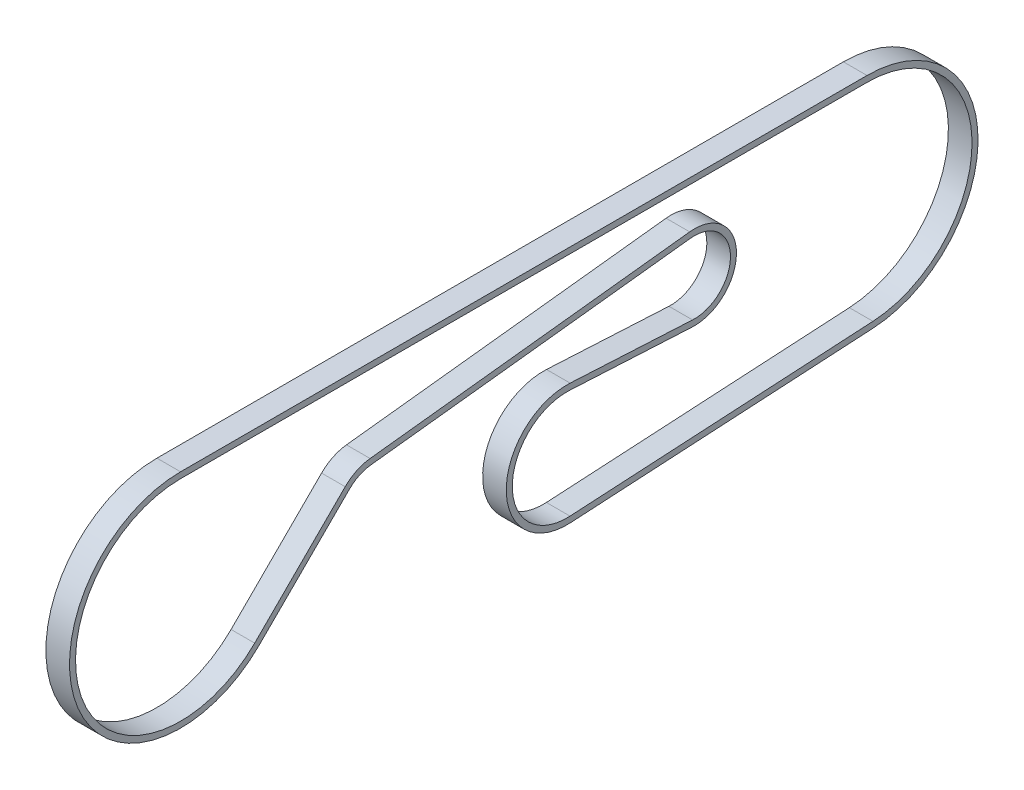
ISO-10303-21;
HEADER;
FILE_DESCRIPTION(('STEP AP214'),'2;1');
FILE_NAME('part.step','',(''),(''),'','','');
FILE_SCHEMA(('AUTOMOTIVE_DESIGN { 1 0 10303 214 1 1 1 1 }'));
ENDSEC;
DATA;
#1=APPLICATION_CONTEXT('core data for automotive mechanical design processes');
#2=APPLICATION_PROTOCOL_DEFINITION('international standard','automotive_design',2000,#1);
#3=PRODUCT_CONTEXT('',#1,'mechanical');
#4=PRODUCT('Part','Part','',(#3));
#5=PRODUCT_RELATED_PRODUCT_CATEGORY('part','',(#4));
#6=PRODUCT_DEFINITION_FORMATION('','',#4);
#7=PRODUCT_DEFINITION_CONTEXT('part definition',#1,'design');
#8=PRODUCT_DEFINITION('design','',#6,#7);
#9=PRODUCT_DEFINITION_SHAPE('','',#8);
#10=(LENGTH_UNIT() NAMED_UNIT(*) SI_UNIT(.MILLI.,.METRE.));
#11=(NAMED_UNIT(*) PLANE_ANGLE_UNIT() SI_UNIT($,.RADIAN.));
#12=(NAMED_UNIT(*) SI_UNIT($,.STERADIAN.) SOLID_ANGLE_UNIT());
#13=UNCERTAINTY_MEASURE_WITH_UNIT(LENGTH_MEASURE(1.E-05),#10,'distance_accuracy_value','');
#14=(GEOMETRIC_REPRESENTATION_CONTEXT(3) GLOBAL_UNCERTAINTY_ASSIGNED_CONTEXT((#13)) GLOBAL_UNIT_ASSIGNED_CONTEXT((#10,
#11,#12)) REPRESENTATION_CONTEXT('',''));
#15=CARTESIAN_POINT('',(0.,0.,0.));
#16=DIRECTION('',(0.,0.,1.));
#17=DIRECTION('',(1.,0.,0.));
#18=AXIS2_PLACEMENT_3D('',#15,#16,#17);
#19=CARTESIAN_POINT('',(4.,-64.0932049847498,68.7662754155776));
#20=DIRECTION('',(-1.,0.,0.));
#21=DIRECTION('',(0.,0.,1.));
#22=AXIS2_PLACEMENT_3D('',#19,#20,#21);
#23=PLANE('',#22);
#24=CARTESIAN_POINT('',(4.,-64.0932049847498,68.7662754155776));
#25=DIRECTION('',(1.,0.,0.));
#26=DIRECTION('',(0.,0.,1.));
#27=AXIS2_PLACEMENT_3D('',#24,#25,#26);
#28=CIRCLE('',#27,18.796);
#29=CARTESIAN_POINT('',(4.,-45.2972049847498,68.7662754155891));
#30=VERTEX_POINT('',#29);
#31=CARTESIAN_POINT('',(4.,-77.407402534687,55.4989561836737));
#32=VERTEX_POINT('',#31);
#33=EDGE_CURVE('E258',#30,#32,#28,.T.);
#34=ORIENTED_EDGE('',*,*,#33,.T.);
#35=DIRECTION('',(0.,0.705858652474131,-0.708352710679789));
#36=VECTOR('',#35,1.);
#37=CARTESIAN_POINT('',(4.,-62.1385864550402,40.1761897615601));
#38=LINE('',#37,#36);
#39=CARTESIAN_POINT('',(4.,-62.1385864550402,40.1761897615601));
#40=VERTEX_POINT('',#39);
#41=EDGE_CURVE('E261',#32,#40,#38,.T.);
#42=ORIENTED_EDGE('',*,*,#41,.T.);
#43=CARTESIAN_POINT('',(4.,-66.4567045793433,35.8732754160784));
#44=DIRECTION('',(-1.,0.,0.));
#45=DIRECTION('',(0.,0.,-1.));
#46=AXIS2_PLACEMENT_3D('',#43,#44,#45);
#47=CIRCLE('',#46,6.09599999999889);
#48=CARTESIAN_POINT('',(4.,-60.400008433644,36.5643960992142));
#49=VERTEX_POINT('',#48);
#50=EDGE_CURVE('E264',#40,#49,#47,.T.);
#51=ORIENTED_EDGE('',*,*,#50,.T.);
#52=DIRECTION('',(0.,0.113372815475126,-0.993552517339292));
#53=VECTOR('',#52,1.);
#54=CARTESIAN_POINT('',(4.,-54.2265088392206,-17.5376039007609));
#55=LINE('',#54,#53);
#56=CARTESIAN_POINT('',(4.,-54.2265088392206,-17.5376039007609));
#57=VERTEX_POINT('',#56);
#58=EDGE_CURVE('E266',#49,#57,#55,.T.);
#59=ORIENTED_EDGE('',*,*,#58,.T.);
#60=CARTESIAN_POINT('',(4.,-60.2832049849702,-18.2287245834654));
#61=DIRECTION('',(-1.,0.,0.));
#62=DIRECTION('',(0.,0.,-1.));
#63=AXIS2_PLACEMENT_3D('',#60,#61,#62);
#64=CIRCLE('',#63,6.09599999999998);
#65=CARTESIAN_POINT('',(4.,-66.3706503664163,-17.9058860357203));
#66=VERTEX_POINT('',#65);
#67=EDGE_CURVE('E268',#57,#66,#64,.T.);
#68=ORIENTED_EDGE('',*,*,#67,.T.);
#69=DIRECTION('',(0.,0.0529590794253495,0.998596683304336));
#70=VECTOR('',#69,1.);
#71=CARTESIAN_POINT('',(4.,-65.2716114573325,2.81759747914179));
#72=LINE('',#71,#70);
#73=CARTESIAN_POINT('',(4.,-65.2716114573325,2.81759747914179));
#74=VERTEX_POINT('',#73);
#75=EDGE_CURVE('E270',#66,#74,#72,.T.);
#76=ORIENTED_EDGE('',*,*,#75,.T.);
#77=CARTESIAN_POINT('',(4.,-75.5232050081349,3.36127538852227));
#78=DIRECTION('',(1.,0.,0.));
#79=DIRECTION('',(0.,0.,1.));
#80=AXIS2_PLACEMENT_3D('',#77,#78,#79);
#81=CIRCLE('',#80,10.2660000000001);
#82=CARTESIAN_POINT('',(4.,-85.7726755011389,2.77894334145401));
#83=VERTEX_POINT('',#82);
#84=EDGE_CURVE('E272',#74,#83,#81,.T.);
#85=ORIENTED_EDGE('',*,*,#84,.T.);
#86=DIRECTION('',(0.,0.0567243373337524,-0.998389878531452));
#87=VECTOR('',#86,1.);
#88=CARTESIAN_POINT('',(4.,-82.8589411416271,-48.5049152279271));
#89=LINE('',#88,#87);
#90=CARTESIAN_POINT('',(4.,-82.8589411416271,-48.5049152279271));
#91=VERTEX_POINT('',#90);
#92=EDGE_CURVE('E274',#83,#91,#89,.T.);
#93=ORIENTED_EDGE('',*,*,#92,.T.);
#94=CARTESIAN_POINT('',(4.,-64.0932049847498,-47.4387245834016));
#95=DIRECTION('',(1.,0.,0.));
#96=DIRECTION('',(0.,0.,-1.));
#97=AXIS2_PLACEMENT_3D('',#94,#95,#96);
#98=CIRCLE('',#97,18.7960000000001);
#99=CARTESIAN_POINT('',(4.,-45.2972049847497,-47.4387245833902));
#100=VERTEX_POINT('',#99);
#101=EDGE_CURVE('E276',#91,#100,#98,.T.);
#102=ORIENTED_EDGE('',*,*,#101,.T.);
#103=DIRECTION('',(0.,0.,1.));
#104=VECTOR('',#103,1.);
#105=CARTESIAN_POINT('',(4.,-45.2972049847498,68.7662754155891));
#106=LINE('',#105,#104);
#107=EDGE_CURVE('E278',#100,#30,#106,.T.);
#108=ORIENTED_EDGE('',*,*,#107,.T.);
#109=EDGE_LOOP('',(#34,#42,#51,#59,#68,#76,#85,#93,#102,#108));
#110=FACE_BOUND('',#109,.T.);
#111=CARTESIAN_POINT('',(4.,-64.0932049847498,-47.4387245834016));
#112=DIRECTION('',(1.,0.,0.));
#113=DIRECTION('',(0.,0.,-1.));
#114=AXIS2_PLACEMENT_3D('',#111,#112,#113);
#115=CIRCLE('',#114,17.78);
#116=CARTESIAN_POINT('',(4.,-81.8445770250391,-48.447283301196));
#117=VERTEX_POINT('',#116);
#118=CARTESIAN_POINT('',(4.,-46.3132049847499,-47.4387245834016));
#119=VERTEX_POINT('',#118);
#120=EDGE_CURVE('E179',#117,#119,#115,.T.);
#121=ORIENTED_EDGE('',*,*,#120,.F.);
#122=DIRECTION('',(0.,0.0567243373337524,-0.998389878531452));
#123=VECTOR('',#122,1.);
#124=CARTESIAN_POINT('',(4.,-81.8445770250391,-48.447283301196));
#125=LINE('',#124,#123);
#126=CARTESIAN_POINT('',(4.,-84.758311384551,2.83657526818516));
#127=VERTEX_POINT('',#126);
#128=EDGE_CURVE('E216',#127,#117,#125,.T.);
#129=ORIENTED_EDGE('',*,*,#128,.F.);
#130=CARTESIAN_POINT('',(4.,-75.5232050081349,3.36127538852227));
#131=DIRECTION('',(1.,0.,0.));
#132=DIRECTION('',(0.,0.,1.));
#133=AXIS2_PLACEMENT_3D('',#130,#131,#132);
#134=CIRCLE('',#133,9.25000000000014);
#135=CARTESIAN_POINT('',(4.,-66.2861856875697,2.87140390383788));
#136=VERTEX_POINT('',#135);
#137=EDGE_CURVE('E214',#136,#127,#134,.T.);
#138=ORIENTED_EDGE('',*,*,#137,.F.);
#139=DIRECTION('',(0.,0.0529590794253498,0.998596683304336));
#140=VECTOR('',#139,1.);
#141=CARTESIAN_POINT('',(4.,-66.2861856875697,2.87140390383789));
#142=LINE('',#141,#140);
#143=CARTESIAN_POINT('',(4.,-67.3852245966529,-17.8520796110115));
#144=VERTEX_POINT('',#143);
#145=EDGE_CURVE('E212',#144,#136,#142,.T.);
#146=ORIENTED_EDGE('',*,*,#145,.F.);
#147=CARTESIAN_POINT('',(4.,-60.2832049849576,-18.2287245838865));
#148=DIRECTION('',(-1.,0.,0.));
#149=DIRECTION('',(0.,0.,-1.));
#150=AXIS2_PLACEMENT_3D('',#147,#148,#149);
#151=CIRCLE('',#150,7.11200000003491);
#152=CARTESIAN_POINT('',(4.,-53.2170594816058,-17.4224171202234));
#153=VERTEX_POINT('',#152);
#154=EDGE_CURVE('E210',#153,#144,#151,.T.);
#155=ORIENTED_EDGE('',*,*,#154,.F.);
#156=DIRECTION('',(0.,0.113372815475124,-0.993552517339292));
#157=VECTOR('',#156,1.);
#158=CARTESIAN_POINT('',(4.,-53.2170594816058,-17.4224171202234));
#159=LINE('',#158,#157);
#160=CARTESIAN_POINT('',(4.,-59.3905590760275,36.6795828797374));
#161=VERTEX_POINT('',#160);
#162=EDGE_CURVE('E208',#161,#153,#159,.T.);
#163=ORIENTED_EDGE('',*,*,#162,.F.);
#164=CARTESIAN_POINT('',(4.,-66.4567045793434,35.8732754160784));
#165=DIRECTION('',(-1.,0.,0.));
#166=DIRECTION('',(0.,0.,-1.));
#167=AXIS2_PLACEMENT_3D('',#164,#165,#166);
#168=CIRCLE('',#167,7.11199999999888);
#169=CARTESIAN_POINT('',(4.,-61.4189001009895,40.8933421524737));
#170=VERTEX_POINT('',#169);
#171=EDGE_CURVE('E206',#170,#161,#168,.T.);
#172=ORIENTED_EDGE('',*,*,#171,.F.);
#173=DIRECTION('',(0.,0.70585865247413,-0.708352710679789));
#174=VECTOR('',#173,1.);
#175=CARTESIAN_POINT('',(4.,-61.4189001009895,40.8933421524737));
#176=LINE('',#175,#174);
#177=CARTESIAN_POINT('',(4.,-76.6877161806366,56.2161085745875));
#178=VERTEX_POINT('',#177);
#179=EDGE_CURVE('E202',#178,#170,#176,.T.);
#180=ORIENTED_EDGE('',*,*,#179,.F.);
#181=CARTESIAN_POINT('',(4.,-64.0932049847499,68.7662754155776));
#182=DIRECTION('',(1.,0.,0.));
#183=DIRECTION('',(0.,0.,1.));
#184=AXIS2_PLACEMENT_3D('',#181,#182,#183);
#185=CIRCLE('',#184,17.78);
#186=CARTESIAN_POINT('',(4.,-46.3132049847499,68.7662754155776));
#187=VERTEX_POINT('',#186);
#188=EDGE_CURVE('E200',#187,#178,#185,.T.);
#189=ORIENTED_EDGE('',*,*,#188,.F.);
#190=DIRECTION('',(0.,0.,1.));
#191=VECTOR('',#190,1.);
#192=CARTESIAN_POINT('',(4.,-46.3132049847499,68.7662754155776));
#193=LINE('',#192,#191);
#194=EDGE_CURVE('E187',#119,#187,#193,.T.);
#195=ORIENTED_EDGE('',*,*,#194,.F.);
#196=EDGE_LOOP('',(#121,#129,#138,#146,#155,#163,#172,#180,#189,#195));
#197=FACE_BOUND('',#196,.T.);
#198=ADVANCED_FACE('F42',(#110,#197),#23,.F.);
#199=CARTESIAN_POINT('',(0.,-64.0932049847498,68.7662754155776));
#200=DIRECTION('',(-1.,0.,0.));
#201=DIRECTION('',(0.,0.,1.));
#202=AXIS2_PLACEMENT_3D('',#199,#200,#201);
#203=PLANE('',#202);
#204=CARTESIAN_POINT('',(0.,-64.0932049847498,68.7662754155776));
#205=DIRECTION('',(1.,0.,0.));
#206=DIRECTION('',(0.,0.,1.));
#207=AXIS2_PLACEMENT_3D('',#204,#205,#206);
#208=CIRCLE('',#207,18.796);
#209=CARTESIAN_POINT('',(0.,-45.2972049847498,68.7662754155891));
#210=VERTEX_POINT('',#209);
#211=CARTESIAN_POINT('',(0.,-77.407402534687,55.4989561836737));
#212=VERTEX_POINT('',#211);
#213=EDGE_CURVE('E195',#210,#212,#208,.T.);
#214=ORIENTED_EDGE('',*,*,#213,.F.);
#215=DIRECTION('',(0.,0.,1.));
#216=VECTOR('',#215,1.);
#217=CARTESIAN_POINT('',(0.,-45.2972049847498,68.7662754155891));
#218=LINE('',#217,#216);
#219=CARTESIAN_POINT('',(0.,-45.2972049847497,-47.4387245833902));
#220=VERTEX_POINT('',#219);
#221=EDGE_CURVE('E262',#220,#210,#218,.T.);
#222=ORIENTED_EDGE('',*,*,#221,.F.);
#223=CARTESIAN_POINT('',(0.,-64.0932049847498,-47.4387245834016));
#224=DIRECTION('',(1.,0.,0.));
#225=DIRECTION('',(0.,0.,-1.));
#226=AXIS2_PLACEMENT_3D('',#223,#224,#225);
#227=CIRCLE('',#226,18.7960000000001);
#228=CARTESIAN_POINT('',(0.,-82.8589411416271,-48.5049152279271));
#229=VERTEX_POINT('',#228);
#230=EDGE_CURVE('E297',#229,#220,#227,.T.);
#231=ORIENTED_EDGE('',*,*,#230,.F.);
#232=DIRECTION('',(0.,0.0567243373337524,-0.998389878531452));
#233=VECTOR('',#232,1.);
#234=CARTESIAN_POINT('',(0.,-82.8589411416271,-48.5049152279271));
#235=LINE('',#234,#233);
#236=CARTESIAN_POINT('',(0.,-85.7726755011389,2.77894334145401));
#237=VERTEX_POINT('',#236);
#238=EDGE_CURVE('E295',#237,#229,#235,.T.);
#239=ORIENTED_EDGE('',*,*,#238,.F.);
#240=CARTESIAN_POINT('',(0.,-75.5232050081349,3.36127538852227));
#241=DIRECTION('',(1.,0.,0.));
#242=DIRECTION('',(0.,0.,1.));
#243=AXIS2_PLACEMENT_3D('',#240,#241,#242);
#244=CIRCLE('',#243,10.2660000000001);
#245=CARTESIAN_POINT('',(0.,-65.2716114573325,2.81759747914179));
#246=VERTEX_POINT('',#245);
#247=EDGE_CURVE('E293',#246,#237,#244,.T.);
#248=ORIENTED_EDGE('',*,*,#247,.F.);
#249=DIRECTION('',(0.,0.0529590794253495,0.998596683304336));
#250=VECTOR('',#249,1.);
#251=CARTESIAN_POINT('',(0.,-65.2716114573325,2.81759747914179));
#252=LINE('',#251,#250);
#253=CARTESIAN_POINT('',(0.,-66.3706503664163,-17.9058860357203));
#254=VERTEX_POINT('',#253);
#255=EDGE_CURVE('E291',#254,#246,#252,.T.);
#256=ORIENTED_EDGE('',*,*,#255,.F.);
#257=CARTESIAN_POINT('',(0.,-60.2832049849702,-18.2287245834654));
#258=DIRECTION('',(-1.,0.,0.));
#259=DIRECTION('',(0.,0.,-1.));
#260=AXIS2_PLACEMENT_3D('',#257,#258,#259);
#261=CIRCLE('',#260,6.09599999999998);
#262=CARTESIAN_POINT('',(0.,-54.2265088392206,-17.5376039007609));
#263=VERTEX_POINT('',#262);
#264=EDGE_CURVE('E289',#263,#254,#261,.T.);
#265=ORIENTED_EDGE('',*,*,#264,.F.);
#266=DIRECTION('',(0.,0.113372815475126,-0.993552517339292));
#267=VECTOR('',#266,1.);
#268=CARTESIAN_POINT('',(0.,-54.2265088392206,-17.5376039007609));
#269=LINE('',#268,#267);
#270=CARTESIAN_POINT('',(0.,-60.400008433644,36.5643960992142));
#271=VERTEX_POINT('',#270);
#272=EDGE_CURVE('E287',#271,#263,#269,.T.);
#273=ORIENTED_EDGE('',*,*,#272,.F.);
#274=CARTESIAN_POINT('',(0.,-66.4567045793433,35.8732754160784));
#275=DIRECTION('',(-1.,0.,0.));
#276=DIRECTION('',(0.,0.,-1.));
#277=AXIS2_PLACEMENT_3D('',#274,#275,#276);
#278=CIRCLE('',#277,6.09599999999889);
#279=CARTESIAN_POINT('',(0.,-62.1385864550402,40.1761897615601));
#280=VERTEX_POINT('',#279);
#281=EDGE_CURVE('E285',#280,#271,#278,.T.);
#282=ORIENTED_EDGE('',*,*,#281,.F.);
#283=DIRECTION('',(0.,0.705858652474131,-0.708352710679789));
#284=VECTOR('',#283,1.);
#285=CARTESIAN_POINT('',(0.,-62.1385864550402,40.1761897615601));
#286=LINE('',#285,#284);
#287=EDGE_CURVE('E283',#212,#280,#286,.T.);
#288=ORIENTED_EDGE('',*,*,#287,.F.);
#289=EDGE_LOOP('',(#214,#222,#231,#239,#248,#256,#265,#273,#282,#288));
#290=FACE_BOUND('',#289,.T.);
#291=DIRECTION('',(0.,0.0567243373337524,-0.998389878531452));
#292=VECTOR('',#291,1.);
#293=CARTESIAN_POINT('',(0.,-81.8445770250391,-48.447283301196));
#294=LINE('',#293,#292);
#295=CARTESIAN_POINT('',(0.,-84.758311384551,2.83657526818515));
#296=VERTEX_POINT('',#295);
#297=CARTESIAN_POINT('',(0.,-81.8445770250391,-48.447283301196));
#298=VERTEX_POINT('',#297);
#299=EDGE_CURVE('E188',#296,#298,#294,.T.);
#300=ORIENTED_EDGE('',*,*,#299,.T.);
#301=CARTESIAN_POINT('',(0.,-64.0932049847498,-47.4387245834016));
#302=DIRECTION('',(1.,0.,0.));
#303=DIRECTION('',(0.,0.,-1.));
#304=AXIS2_PLACEMENT_3D('',#301,#302,#303);
#305=CIRCLE('',#304,17.78);
#306=CARTESIAN_POINT('',(0.,-46.3132049847499,-47.4387245834016));
#307=VERTEX_POINT('',#306);
#308=EDGE_CURVE('E65',#298,#307,#305,.T.);
#309=ORIENTED_EDGE('',*,*,#308,.T.);
#310=DIRECTION('',(0.,0.,1.));
#311=VECTOR('',#310,1.);
#312=CARTESIAN_POINT('',(0.,-46.3132049847499,68.7662754155776));
#313=LINE('',#312,#311);
#314=CARTESIAN_POINT('',(0.,-46.3132049847499,68.7662754155776));
#315=VERTEX_POINT('',#314);
#316=EDGE_CURVE('E194',#307,#315,#313,.T.);
#317=ORIENTED_EDGE('',*,*,#316,.T.);
#318=CARTESIAN_POINT('',(0.,-64.0932049847499,68.7662754155776));
#319=DIRECTION('',(1.,0.,0.));
#320=DIRECTION('',(0.,0.,1.));
#321=AXIS2_PLACEMENT_3D('',#318,#319,#320);
#322=CIRCLE('',#321,17.78);
#323=CARTESIAN_POINT('',(0.,-76.6877161806366,56.2161085745875));
#324=VERTEX_POINT('',#323);
#325=EDGE_CURVE('E220',#315,#324,#322,.T.);
#326=ORIENTED_EDGE('',*,*,#325,.T.);
#327=DIRECTION('',(0.,0.70585865247413,-0.708352710679789));
#328=VECTOR('',#327,1.);
#329=CARTESIAN_POINT('',(0.,-61.4189001009895,40.8933421524737));
#330=LINE('',#329,#328);
#331=CARTESIAN_POINT('',(0.,-61.4189001009895,40.8933421524737));
#332=VERTEX_POINT('',#331);
#333=EDGE_CURVE('E223',#324,#332,#330,.T.);
#334=ORIENTED_EDGE('',*,*,#333,.T.);
#335=CARTESIAN_POINT('',(0.,-66.4567045793434,35.8732754160784));
#336=DIRECTION('',(-1.,0.,0.));
#337=DIRECTION('',(0.,0.,-1.));
#338=AXIS2_PLACEMENT_3D('',#335,#336,#337);
#339=CIRCLE('',#338,7.11199999999888);
#340=CARTESIAN_POINT('',(0.,-59.3905590760275,36.6795828797374));
#341=VERTEX_POINT('',#340);
#342=EDGE_CURVE('E226',#332,#341,#339,.T.);
#343=ORIENTED_EDGE('',*,*,#342,.T.);
#344=DIRECTION('',(0.,0.113372815475124,-0.993552517339292));
#345=VECTOR('',#344,1.);
#346=CARTESIAN_POINT('',(0.,-53.2170594816058,-17.4224171202234));
#347=LINE('',#346,#345);
#348=CARTESIAN_POINT('',(0.,-53.2170594816058,-17.4224171202234));
#349=VERTEX_POINT('',#348);
#350=EDGE_CURVE('E229',#341,#349,#347,.T.);
#351=ORIENTED_EDGE('',*,*,#350,.T.);
#352=CARTESIAN_POINT('',(0.,-60.2832049849576,-18.2287245838865));
#353=DIRECTION('',(-1.,0.,0.));
#354=DIRECTION('',(0.,0.,-1.));
#355=AXIS2_PLACEMENT_3D('',#352,#353,#354);
#356=CIRCLE('',#355,7.11200000003491);
#357=CARTESIAN_POINT('',(0.,-67.3852245966529,-17.8520796110115));
#358=VERTEX_POINT('',#357);
#359=EDGE_CURVE('E232',#349,#358,#356,.T.);
#360=ORIENTED_EDGE('',*,*,#359,.T.);
#361=DIRECTION('',(0.,0.0529590794253498,0.998596683304336));
#362=VECTOR('',#361,1.);
#363=CARTESIAN_POINT('',(0.,-66.2861856875697,2.87140390383789));
#364=LINE('',#363,#362);
#365=CARTESIAN_POINT('',(0.,-66.2861856875697,2.87140390383788));
#366=VERTEX_POINT('',#365);
#367=EDGE_CURVE('E235',#358,#366,#364,.T.);
#368=ORIENTED_EDGE('',*,*,#367,.T.);
#369=CARTESIAN_POINT('',(0.,-75.5232050081349,3.36127538852227));
#370=DIRECTION('',(1.,0.,0.));
#371=DIRECTION('',(0.,0.,1.));
#372=AXIS2_PLACEMENT_3D('',#369,#370,#371);
#373=CIRCLE('',#372,9.25000000000014);
#374=EDGE_CURVE('E238',#366,#296,#373,.T.);
#375=ORIENTED_EDGE('',*,*,#374,.T.);
#376=EDGE_LOOP('',(#300,#309,#317,#326,#334,#343,#351,#360,#368,#375));
#377=FACE_BOUND('',#376,.T.);
#378=ADVANCED_FACE('F333',(#290,#377),#203,.T.);
#379=CARTESIAN_POINT('',(4.,-64.0932049847498,68.7662754155776));
#380=DIRECTION('',(-1.,0.,0.));
#381=DIRECTION('',(0.,0.,1.));
#382=AXIS2_PLACEMENT_3D('',#379,#380,#381);
#383=CYLINDRICAL_SURFACE('',#382,18.796);
#384=ORIENTED_EDGE('',*,*,#213,.T.);
#385=DIRECTION('',(-1.,0.,0.));
#386=VECTOR('',#385,1.);
#387=CARTESIAN_POINT('',(4.,-77.407402534687,55.4989561836737));
#388=LINE('',#387,#386);
#389=EDGE_CURVE('E11',#32,#212,#388,.T.);
#390=ORIENTED_EDGE('',*,*,#389,.F.);
#391=ORIENTED_EDGE('',*,*,#33,.F.);
#392=DIRECTION('',(-1.,0.,0.));
#393=VECTOR('',#392,1.);
#394=CARTESIAN_POINT('',(4.,-45.2972049847498,68.7662754155891));
#395=LINE('',#394,#393);
#396=EDGE_CURVE('E280',#30,#210,#395,.T.);
#397=ORIENTED_EDGE('',*,*,#396,.T.);
#398=EDGE_LOOP('',(#384,#390,#391,#397));
#399=FACE_BOUND('',#398,.T.);
#400=ADVANCED_FACE('F44',(#399),#383,.T.);
#401=CARTESIAN_POINT('',(4.,-62.1385864550402,40.1761897615601));
#402=DIRECTION('',(0.,0.708352710679789,0.705858652474131));
#403=DIRECTION('',(0.,-0.705858652474131,0.708352710679789));
#404=AXIS2_PLACEMENT_3D('',#401,#402,#403);
#405=PLANE('',#404);
#406=ORIENTED_EDGE('',*,*,#287,.T.);
#407=DIRECTION('',(-1.,0.,0.));
#408=VECTOR('',#407,1.);
#409=CARTESIAN_POINT('',(4.,-62.1385864550402,40.1761897615601));
#410=LINE('',#409,#408);
#411=EDGE_CURVE('E50',#40,#280,#410,.T.);
#412=ORIENTED_EDGE('',*,*,#411,.F.);
#413=ORIENTED_EDGE('',*,*,#41,.F.);
#414=ORIENTED_EDGE('',*,*,#389,.T.);
#415=EDGE_LOOP('',(#406,#412,#413,#414));
#416=FACE_BOUND('',#415,.T.);
#417=ADVANCED_FACE('F350',(#416),#405,.F.);
#418=CARTESIAN_POINT('',(4.,-66.4567045793433,35.8732754160784));
#419=DIRECTION('',(-1.,0.,0.));
#420=DIRECTION('',(0.,0.,1.));
#421=AXIS2_PLACEMENT_3D('',#418,#419,#420);
#422=CYLINDRICAL_SURFACE('',#421,6.09599999999889);
#423=ORIENTED_EDGE('',*,*,#281,.T.);
#424=DIRECTION('',(-1.,0.,0.));
#425=VECTOR('',#424,1.);
#426=CARTESIAN_POINT('',(4.,-60.400008433644,36.5643960992142));
#427=LINE('',#426,#425);
#428=EDGE_CURVE('E320',#49,#271,#427,.T.);
#429=ORIENTED_EDGE('',*,*,#428,.F.);
#430=ORIENTED_EDGE('',*,*,#50,.F.);
#431=ORIENTED_EDGE('',*,*,#411,.T.);
#432=EDGE_LOOP('',(#423,#429,#430,#431));
#433=FACE_BOUND('',#432,.T.);
#434=ADVANCED_FACE('F327',(#433),#422,.F.);
#435=CARTESIAN_POINT('',(4.,-54.2265088392206,-17.5376039007609));
#436=DIRECTION('',(0.,0.993552517339292,0.113372815475126));
#437=DIRECTION('',(0.,-0.113372815475126,0.993552517339292));
#438=AXIS2_PLACEMENT_3D('',#435,#436,#437);
#439=PLANE('',#438);
#440=ORIENTED_EDGE('',*,*,#272,.T.);
#441=DIRECTION('',(-1.,0.,0.));
#442=VECTOR('',#441,1.);
#443=CARTESIAN_POINT('',(4.,-54.2265088392206,-17.5376039007609));
#444=LINE('',#443,#442);
#445=EDGE_CURVE('E317',#57,#263,#444,.T.);
#446=ORIENTED_EDGE('',*,*,#445,.F.);
#447=ORIENTED_EDGE('',*,*,#58,.F.);
#448=ORIENTED_EDGE('',*,*,#428,.T.);
#449=EDGE_LOOP('',(#440,#446,#447,#448));
#450=FACE_BOUND('',#449,.T.);
#451=ADVANCED_FACE('F339',(#450),#439,.F.);
#452=CARTESIAN_POINT('',(4.,-60.2832049849702,-18.2287245834654));
#453=DIRECTION('',(-1.,0.,0.));
#454=DIRECTION('',(0.,0.,1.));
#455=AXIS2_PLACEMENT_3D('',#452,#453,#454);
#456=CYLINDRICAL_SURFACE('',#455,6.09599999999998);
#457=ORIENTED_EDGE('',*,*,#264,.T.);
#458=DIRECTION('',(-1.,0.,0.));
#459=VECTOR('',#458,1.);
#460=CARTESIAN_POINT('',(4.,-66.3706503664163,-17.9058860357203));
#461=LINE('',#460,#459);
#462=EDGE_CURVE('E314',#66,#254,#461,.T.);
#463=ORIENTED_EDGE('',*,*,#462,.F.);
#464=ORIENTED_EDGE('',*,*,#67,.F.);
#465=ORIENTED_EDGE('',*,*,#445,.T.);
#466=EDGE_LOOP('',(#457,#463,#464,#465));
#467=FACE_BOUND('',#466,.T.);
#468=ADVANCED_FACE('F343',(#467),#456,.F.);
#469=CARTESIAN_POINT('',(4.,-65.2716114573325,2.81759747914179));
#470=DIRECTION('',(0.,-0.998596683304336,0.0529590794253495));
#471=DIRECTION('',(0.,-0.0529590794253495,-0.998596683304336));
#472=AXIS2_PLACEMENT_3D('',#469,#470,#471);
#473=PLANE('',#472);
#474=ORIENTED_EDGE('',*,*,#255,.T.);
#475=DIRECTION('',(-1.,0.,0.));
#476=VECTOR('',#475,1.);
#477=CARTESIAN_POINT('',(4.,-65.2716114573325,2.81759747914179));
#478=LINE('',#477,#476);
#479=EDGE_CURVE('E311',#74,#246,#478,.T.);
#480=ORIENTED_EDGE('',*,*,#479,.F.);
#481=ORIENTED_EDGE('',*,*,#75,.F.);
#482=ORIENTED_EDGE('',*,*,#462,.T.);
#483=EDGE_LOOP('',(#474,#480,#481,#482));
#484=FACE_BOUND('',#483,.T.);
#485=ADVANCED_FACE('F373',(#484),#473,.F.);
#486=CARTESIAN_POINT('',(4.,-75.5232050081349,3.36127538852227));
#487=DIRECTION('',(-1.,0.,0.));
#488=DIRECTION('',(0.,0.,1.));
#489=AXIS2_PLACEMENT_3D('',#486,#487,#488);
#490=CYLINDRICAL_SURFACE('',#489,10.2660000000001);
#491=ORIENTED_EDGE('',*,*,#247,.T.);
#492=DIRECTION('',(-1.,0.,0.));
#493=VECTOR('',#492,1.);
#494=CARTESIAN_POINT('',(4.,-85.7726755011389,2.77894334145401));
#495=LINE('',#494,#493);
#496=EDGE_CURVE('E308',#83,#237,#495,.T.);
#497=ORIENTED_EDGE('',*,*,#496,.F.);
#498=ORIENTED_EDGE('',*,*,#84,.F.);
#499=ORIENTED_EDGE('',*,*,#479,.T.);
#500=EDGE_LOOP('',(#491,#497,#498,#499));
#501=FACE_BOUND('',#500,.T.);
#502=ADVANCED_FACE('F370',(#501),#490,.T.);
#503=CARTESIAN_POINT('',(4.,-82.8589411416271,-48.5049152279271));
#504=DIRECTION('',(0.,0.998389878531451,0.0567243373337524));
#505=DIRECTION('',(0.,-0.0567243373337524,0.998389878531452));
#506=AXIS2_PLACEMENT_3D('',#503,#504,#505);
#507=PLANE('',#506);
#508=ORIENTED_EDGE('',*,*,#238,.T.);
#509=DIRECTION('',(-1.,0.,0.));
#510=VECTOR('',#509,1.);
#511=CARTESIAN_POINT('',(4.,-82.8589411416271,-48.5049152279271));
#512=LINE('',#511,#510);
#513=EDGE_CURVE('E305',#91,#229,#512,.T.);
#514=ORIENTED_EDGE('',*,*,#513,.F.);
#515=ORIENTED_EDGE('',*,*,#92,.F.);
#516=ORIENTED_EDGE('',*,*,#496,.T.);
#517=EDGE_LOOP('',(#508,#514,#515,#516));
#518=FACE_BOUND('',#517,.T.);
#519=ADVANCED_FACE('F366',(#518),#507,.F.);
#520=CARTESIAN_POINT('',(4.,-64.0932049847498,-47.4387245834016));
#521=DIRECTION('',(-1.,0.,0.));
#522=DIRECTION('',(0.,0.,1.));
#523=AXIS2_PLACEMENT_3D('',#520,#521,#522);
#524=CYLINDRICAL_SURFACE('',#523,18.7960000000001);
#525=ORIENTED_EDGE('',*,*,#230,.T.);
#526=DIRECTION('',(-1.,0.,0.));
#527=VECTOR('',#526,1.);
#528=CARTESIAN_POINT('',(4.,-45.2972049847497,-47.4387245833902));
#529=LINE('',#528,#527);
#530=EDGE_CURVE('E302',#100,#220,#529,.T.);
#531=ORIENTED_EDGE('',*,*,#530,.F.);
#532=ORIENTED_EDGE('',*,*,#101,.F.);
#533=ORIENTED_EDGE('',*,*,#513,.T.);
#534=EDGE_LOOP('',(#525,#531,#532,#533));
#535=FACE_BOUND('',#534,.T.);
#536=ADVANCED_FACE('F362',(#535),#524,.T.);
#537=CARTESIAN_POINT('',(4.,-45.2972049847498,68.7662754155891));
#538=DIRECTION('',(0.,-1.,0.));
#539=DIRECTION('',(0.,0.,-1.));
#540=AXIS2_PLACEMENT_3D('',#537,#538,#539);
#541=PLANE('',#540);
#542=ORIENTED_EDGE('',*,*,#221,.T.);
#543=ORIENTED_EDGE('',*,*,#396,.F.);
#544=ORIENTED_EDGE('',*,*,#107,.F.);
#545=ORIENTED_EDGE('',*,*,#530,.T.);
#546=EDGE_LOOP('',(#542,#543,#544,#545));
#547=FACE_BOUND('',#546,.T.);
#548=ADVANCED_FACE('F357',(#547),#541,.F.);
#549=CARTESIAN_POINT('',(4.,-64.0932049847498,-47.4387245834016));
#550=DIRECTION('',(-1.,0.,0.));
#551=DIRECTION('',(0.,0.,1.));
#552=AXIS2_PLACEMENT_3D('',#549,#550,#551);
#553=CYLINDRICAL_SURFACE('',#552,17.78);
#554=ORIENTED_EDGE('',*,*,#308,.F.);
#555=DIRECTION('',(-1.,0.,0.));
#556=VECTOR('',#555,1.);
#557=CARTESIAN_POINT('',(4.,-81.8445770250391,-48.447283301196));
#558=LINE('',#557,#556);
#559=EDGE_CURVE('E183',#117,#298,#558,.T.);
#560=ORIENTED_EDGE('',*,*,#559,.F.);
#561=ORIENTED_EDGE('',*,*,#120,.T.);
#562=DIRECTION('',(-1.,0.,0.));
#563=VECTOR('',#562,1.);
#564=CARTESIAN_POINT('',(4.,-46.3132049847499,-47.4387245834016));
#565=LINE('',#564,#563);
#566=EDGE_CURVE('E182',#119,#307,#565,.T.);
#567=ORIENTED_EDGE('',*,*,#566,.T.);
#568=EDGE_LOOP('',(#554,#560,#561,#567));
#569=FACE_BOUND('',#568,.T.);
#570=ADVANCED_FACE('F181',(#569),#553,.F.);
#571=CARTESIAN_POINT('',(4.,-46.3132049847499,68.7662754155776));
#572=DIRECTION('',(0.,-1.,0.));
#573=DIRECTION('',(0.,0.,-1.));
#574=AXIS2_PLACEMENT_3D('',#571,#572,#573);
#575=PLANE('',#574);
#576=ORIENTED_EDGE('',*,*,#316,.F.);
#577=ORIENTED_EDGE('',*,*,#566,.F.);
#578=ORIENTED_EDGE('',*,*,#194,.T.);
#579=DIRECTION('',(-1.,0.,0.));
#580=VECTOR('',#579,1.);
#581=CARTESIAN_POINT('',(4.,-46.3132049847499,68.7662754155776));
#582=LINE('',#581,#580);
#583=EDGE_CURVE('E196',#187,#315,#582,.T.);
#584=ORIENTED_EDGE('',*,*,#583,.T.);
#585=EDGE_LOOP('',(#576,#577,#578,#584));
#586=FACE_BOUND('',#585,.T.);
#587=ADVANCED_FACE('F191',(#586),#575,.T.);
#588=CARTESIAN_POINT('',(4.,-64.0932049847499,68.7662754155776));
#589=DIRECTION('',(-1.,0.,0.));
#590=DIRECTION('',(0.,0.,1.));
#591=AXIS2_PLACEMENT_3D('',#588,#589,#590);
#592=CYLINDRICAL_SURFACE('',#591,17.78);
#593=ORIENTED_EDGE('',*,*,#325,.F.);
#594=ORIENTED_EDGE('',*,*,#583,.F.);
#595=ORIENTED_EDGE('',*,*,#188,.T.);
#596=DIRECTION('',(-1.,0.,0.));
#597=VECTOR('',#596,1.);
#598=CARTESIAN_POINT('',(4.,-76.6877161806366,56.2161085745875));
#599=LINE('',#598,#597);
#600=EDGE_CURVE('E255',#178,#324,#599,.T.);
#601=ORIENTED_EDGE('',*,*,#600,.T.);
#602=EDGE_LOOP('',(#593,#594,#595,#601));
#603=FACE_BOUND('',#602,.T.);
#604=ADVANCED_FACE('F423',(#603),#592,.F.);
#605=CARTESIAN_POINT('',(4.,-61.4189001009895,40.8933421524737));
#606=DIRECTION('',(0.,0.708352710679789,0.70585865247413));
#607=DIRECTION('',(0.,-0.70585865247413,0.708352710679789));
#608=AXIS2_PLACEMENT_3D('',#605,#606,#607);
#609=PLANE('',#608);
#610=ORIENTED_EDGE('',*,*,#333,.F.);
#611=ORIENTED_EDGE('',*,*,#600,.F.);
#612=ORIENTED_EDGE('',*,*,#179,.T.);
#613=DIRECTION('',(-1.,0.,0.));
#614=VECTOR('',#613,1.);
#615=CARTESIAN_POINT('',(4.,-61.4189001009895,40.8933421524737));
#616=LINE('',#615,#614);
#617=EDGE_CURVE('E253',#170,#332,#616,.T.);
#618=ORIENTED_EDGE('',*,*,#617,.T.);
#619=EDGE_LOOP('',(#610,#611,#612,#618));
#620=FACE_BOUND('',#619,.T.);
#621=ADVANCED_FACE('F430',(#620),#609,.T.);
#622=CARTESIAN_POINT('',(4.,-66.4567045793434,35.8732754160784));
#623=DIRECTION('',(-1.,0.,0.));
#624=DIRECTION('',(0.,0.,1.));
#625=AXIS2_PLACEMENT_3D('',#622,#623,#624);
#626=CYLINDRICAL_SURFACE('',#625,7.11199999999888);
#627=ORIENTED_EDGE('',*,*,#342,.F.);
#628=ORIENTED_EDGE('',*,*,#617,.F.);
#629=ORIENTED_EDGE('',*,*,#171,.T.);
#630=DIRECTION('',(-1.,0.,0.));
#631=VECTOR('',#630,1.);
#632=CARTESIAN_POINT('',(4.,-59.3905590760275,36.6795828797374));
#633=LINE('',#632,#631);
#634=EDGE_CURVE('E251',#161,#341,#633,.T.);
#635=ORIENTED_EDGE('',*,*,#634,.T.);
#636=EDGE_LOOP('',(#627,#628,#629,#635));
#637=FACE_BOUND('',#636,.T.);
#638=ADVANCED_FACE('F439',(#637),#626,.T.);
#639=CARTESIAN_POINT('',(4.,-53.2170594816058,-17.4224171202234));
#640=DIRECTION('',(0.,0.993552517339292,0.113372815475124));
#641=DIRECTION('',(0.,-0.113372815475124,0.993552517339292));
#642=AXIS2_PLACEMENT_3D('',#639,#640,#641);
#643=PLANE('',#642);
#644=ORIENTED_EDGE('',*,*,#350,.F.);
#645=ORIENTED_EDGE('',*,*,#634,.F.);
#646=ORIENTED_EDGE('',*,*,#162,.T.);
#647=DIRECTION('',(-1.,0.,0.));
#648=VECTOR('',#647,1.);
#649=CARTESIAN_POINT('',(4.,-53.2170594816058,-17.4224171202234));
#650=LINE('',#649,#648);
#651=EDGE_CURVE('E249',#153,#349,#650,.T.);
#652=ORIENTED_EDGE('',*,*,#651,.T.);
#653=EDGE_LOOP('',(#644,#645,#646,#652));
#654=FACE_BOUND('',#653,.T.);
#655=ADVANCED_FACE('F448',(#654),#643,.T.);
#656=CARTESIAN_POINT('',(4.,-60.2832049849576,-18.2287245838865));
#657=DIRECTION('',(-1.,0.,0.));
#658=DIRECTION('',(0.,0.,1.));
#659=AXIS2_PLACEMENT_3D('',#656,#657,#658);
#660=CYLINDRICAL_SURFACE('',#659,7.11200000003491);
#661=ORIENTED_EDGE('',*,*,#359,.F.);
#662=ORIENTED_EDGE('',*,*,#651,.F.);
#663=ORIENTED_EDGE('',*,*,#154,.T.);
#664=DIRECTION('',(-1.,0.,0.));
#665=VECTOR('',#664,1.);
#666=CARTESIAN_POINT('',(4.,-67.3852245966529,-17.8520796110115));
#667=LINE('',#666,#665);
#668=EDGE_CURVE('E247',#144,#358,#667,.T.);
#669=ORIENTED_EDGE('',*,*,#668,.T.);
#670=EDGE_LOOP('',(#661,#662,#663,#669));
#671=FACE_BOUND('',#670,.T.);
#672=ADVANCED_FACE('F457',(#671),#660,.T.);
#673=CARTESIAN_POINT('',(4.,-66.2861856875697,2.87140390383789));
#674=DIRECTION('',(0.,-0.998596683304335,0.0529590794253498));
#675=DIRECTION('',(0.,-0.0529590794253498,-0.998596683304336));
#676=AXIS2_PLACEMENT_3D('',#673,#674,#675);
#677=PLANE('',#676);
#678=ORIENTED_EDGE('',*,*,#367,.F.);
#679=ORIENTED_EDGE('',*,*,#668,.F.);
#680=ORIENTED_EDGE('',*,*,#145,.T.);
#681=DIRECTION('',(-1.,0.,0.));
#682=VECTOR('',#681,1.);
#683=CARTESIAN_POINT('',(4.,-66.2861856875697,2.87140390383788));
#684=LINE('',#683,#682);
#685=EDGE_CURVE('E245',#136,#366,#684,.T.);
#686=ORIENTED_EDGE('',*,*,#685,.T.);
#687=EDGE_LOOP('',(#678,#679,#680,#686));
#688=FACE_BOUND('',#687,.T.);
#689=ADVANCED_FACE('F466',(#688),#677,.T.);
#690=CARTESIAN_POINT('',(4.,-75.5232050081349,3.36127538852227));
#691=DIRECTION('',(-1.,0.,0.));
#692=DIRECTION('',(0.,0.,1.));
#693=AXIS2_PLACEMENT_3D('',#690,#691,#692);
#694=CYLINDRICAL_SURFACE('',#693,9.25000000000014);
#695=ORIENTED_EDGE('',*,*,#374,.F.);
#696=ORIENTED_EDGE('',*,*,#685,.F.);
#697=ORIENTED_EDGE('',*,*,#137,.T.);
#698=DIRECTION('',(-1.,0.,0.));
#699=VECTOR('',#698,1.);
#700=CARTESIAN_POINT('',(4.,-84.758311384551,2.83657526818515));
#701=LINE('',#700,#699);
#702=EDGE_CURVE('E57',#127,#296,#701,.T.);
#703=ORIENTED_EDGE('',*,*,#702,.T.);
#704=EDGE_LOOP('',(#695,#696,#697,#703));
#705=FACE_BOUND('',#704,.T.);
#706=ADVANCED_FACE('F475',(#705),#694,.F.);
#707=CARTESIAN_POINT('',(4.,-81.8445770250391,-48.447283301196));
#708=DIRECTION('',(0.,0.998389878531451,0.0567243373337524));
#709=DIRECTION('',(0.,-0.0567243373337524,0.998389878531452));
#710=AXIS2_PLACEMENT_3D('',#707,#708,#709);
#711=PLANE('',#710);
#712=ORIENTED_EDGE('',*,*,#299,.F.);
#713=ORIENTED_EDGE('',*,*,#702,.F.);
#714=ORIENTED_EDGE('',*,*,#128,.T.);
#715=ORIENTED_EDGE('',*,*,#559,.T.);
#716=EDGE_LOOP('',(#712,#713,#714,#715));
#717=FACE_BOUND('',#716,.T.);
#718=ADVANCED_FACE('F484',(#717),#711,.T.);
#719=CLOSED_SHELL('',(#198,#378,#400,#417,#434,#451,#468,#485,#502,#519,#536,#548,#570,#587,
#604,#621,#638,#655,#672,#689,#706,#718));
#720=MANIFOLD_SOLID_BREP('B2',#719);
#721=ADVANCED_BREP_SHAPE_REPRESENTATION('',(#18,#720),#14);
#722=SHAPE_DEFINITION_REPRESENTATION(#9,#721);
ENDSEC;
END-ISO-10303-21;
